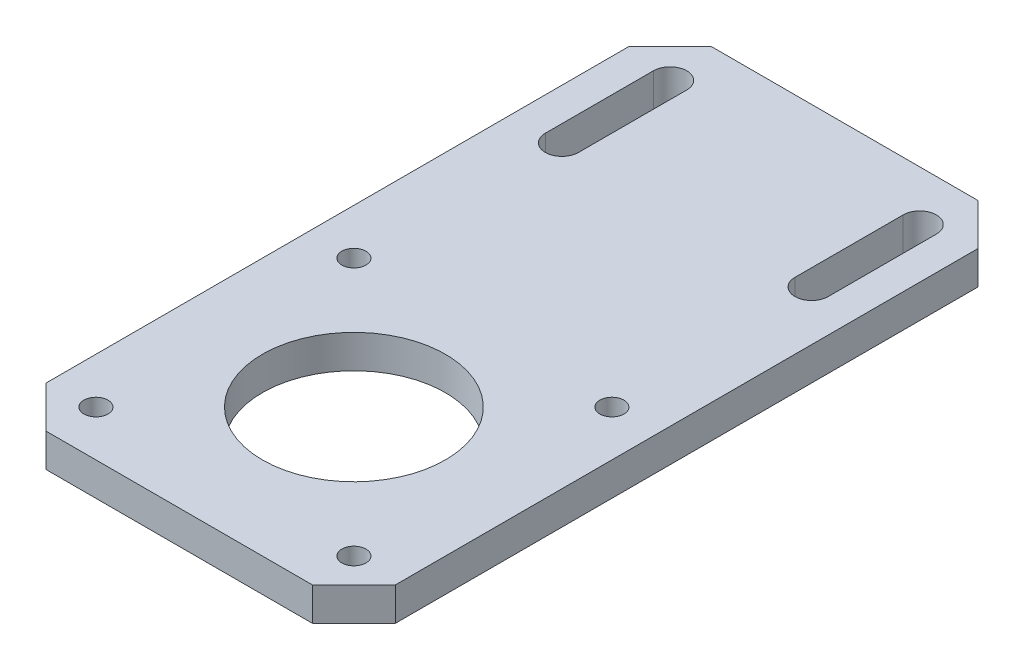
ISO-10303-21;
HEADER;
FILE_DESCRIPTION(('STEP AP214'),'2;1');
FILE_NAME('part.step','',(''),(''),'','','');
FILE_SCHEMA(('AUTOMOTIVE_DESIGN { 1 0 10303 214 1 1 1 1 }'));
ENDSEC;
DATA;
#1=APPLICATION_CONTEXT('core data for automotive mechanical design processes');
#2=APPLICATION_PROTOCOL_DEFINITION('international standard','automotive_design',2000,#1);
#3=PRODUCT_CONTEXT('',#1,'mechanical');
#4=PRODUCT('Part','Part','',(#3));
#5=PRODUCT_RELATED_PRODUCT_CATEGORY('part','',(#4));
#6=PRODUCT_DEFINITION_FORMATION('','',#4);
#7=PRODUCT_DEFINITION_CONTEXT('part definition',#1,'design');
#8=PRODUCT_DEFINITION('design','',#6,#7);
#9=PRODUCT_DEFINITION_SHAPE('','',#8);
#10=(LENGTH_UNIT() NAMED_UNIT(*) SI_UNIT(.MILLI.,.METRE.));
#11=(NAMED_UNIT(*) PLANE_ANGLE_UNIT() SI_UNIT($,.RADIAN.));
#12=(NAMED_UNIT(*) SI_UNIT($,.STERADIAN.) SOLID_ANGLE_UNIT());
#13=UNCERTAINTY_MEASURE_WITH_UNIT(LENGTH_MEASURE(1.E-05),#10,'distance_accuracy_value','');
#14=(GEOMETRIC_REPRESENTATION_CONTEXT(3) GLOBAL_UNCERTAINTY_ASSIGNED_CONTEXT((#13)) GLOBAL_UNIT_ASSIGNED_CONTEXT((#10,
#11,#12)) REPRESENTATION_CONTEXT('',''));
#15=CARTESIAN_POINT('',(0.,0.,0.));
#16=DIRECTION('',(0.,0.,1.));
#17=DIRECTION('',(1.,0.,0.));
#18=AXIS2_PLACEMENT_3D('',#15,#16,#17);
#19=CARTESIAN_POINT('',(0.,4.,0.));
#20=DIRECTION('',(0.,-1.,0.));
#21=DIRECTION('',(0.,0.,-1.));
#22=AXIS2_PLACEMENT_3D('',#19,#20,#21);
#23=PLANE('',#22);
#24=CARTESIAN_POINT('',(6.,4.,-74.));
#25=DIRECTION('',(0.,1.,0.));
#26=DIRECTION('',(0.,0.,1.));
#27=AXIS2_PLACEMENT_3D('',#24,#25,#26);
#28=CIRCLE('',#27,2.);
#29=CARTESIAN_POINT('',(8.,4.,-74.));
#30=VERTEX_POINT('',#29);
#31=CARTESIAN_POINT('',(4.,4.,-74.));
#32=VERTEX_POINT('',#31);
#33=EDGE_CURVE('E194',#30,#32,#28,.T.);
#34=ORIENTED_EDGE('',*,*,#33,.F.);
#35=DIRECTION('',(0.,0.,-1.));
#36=VECTOR('',#35,1.);
#37=CARTESIAN_POINT('',(8.,4.,-74.));
#38=LINE('',#37,#36);
#39=CARTESIAN_POINT('',(8.,4.,-61.));
#40=VERTEX_POINT('',#39);
#41=EDGE_CURVE('E202',#40,#30,#38,.T.);
#42=ORIENTED_EDGE('',*,*,#41,.F.);
#43=CARTESIAN_POINT('',(6.,4.,-61.));
#44=DIRECTION('',(0.,1.,0.));
#45=DIRECTION('',(0.,0.,1.));
#46=AXIS2_PLACEMENT_3D('',#43,#44,#45);
#47=CIRCLE('',#46,2.);
#48=CARTESIAN_POINT('',(4.,4.,-61.));
#49=VERTEX_POINT('',#48);
#50=EDGE_CURVE('E199',#49,#40,#47,.T.);
#51=ORIENTED_EDGE('',*,*,#50,.F.);
#52=DIRECTION('',(0.,0.,1.));
#53=VECTOR('',#52,1.);
#54=CARTESIAN_POINT('',(4.,4.,-74.));
#55=LINE('',#54,#53);
#56=EDGE_CURVE('E196',#32,#49,#55,.T.);
#57=ORIENTED_EDGE('',*,*,#56,.F.);
#58=EDGE_LOOP('',(#34,#42,#51,#57));
#59=FACE_BOUND('',#58,.T.);
#60=DIRECTION('',(0.,0.,-1.));
#61=VECTOR('',#60,1.);
#62=CARTESIAN_POINT('',(42.,4.,0.));
#63=LINE('',#62,#61);
#64=CARTESIAN_POINT('',(42.,4.,-4.99999999999999));
#65=VERTEX_POINT('',#64);
#66=CARTESIAN_POINT('',(42.,4.,-75.));
#67=VERTEX_POINT('',#66);
#68=EDGE_CURVE('E260',#65,#67,#63,.T.);
#69=ORIENTED_EDGE('',*,*,#68,.T.);
#70=DIRECTION('',(0.707106781186546,0.,0.707106781186549));
#71=VECTOR('',#70,1.);
#72=CARTESIAN_POINT('',(37.,4.,-80.));
#73=LINE('',#72,#71);
#74=CARTESIAN_POINT('',(37.,4.,-80.));
#75=VERTEX_POINT('',#74);
#76=EDGE_CURVE('E298',#67,#75,#73,.F.);
#77=ORIENTED_EDGE('',*,*,#76,.T.);
#78=DIRECTION('',(-1.,0.,0.));
#79=VECTOR('',#78,1.);
#80=CARTESIAN_POINT('',(0.,4.,-80.));
#81=LINE('',#80,#79);
#82=CARTESIAN_POINT('',(5.00000000000002,4.,-80.));
#83=VERTEX_POINT('',#82);
#84=EDGE_CURVE('E263',#75,#83,#81,.T.);
#85=ORIENTED_EDGE('',*,*,#84,.T.);
#86=DIRECTION('',(0.707106781186549,0.,-0.707106781186547));
#87=VECTOR('',#86,1.);
#88=CARTESIAN_POINT('',(0.,4.,-75.));
#89=LINE('',#88,#87);
#90=CARTESIAN_POINT('',(0.,4.,-75.));
#91=VERTEX_POINT('',#90);
#92=EDGE_CURVE('E296',#83,#91,#89,.F.);
#93=ORIENTED_EDGE('',*,*,#92,.T.);
#94=DIRECTION('',(0.,0.,1.));
#95=VECTOR('',#94,1.);
#96=CARTESIAN_POINT('',(0.,4.,0.));
#97=LINE('',#96,#95);
#98=CARTESIAN_POINT('',(0.,4.,-5.00000000000002));
#99=VERTEX_POINT('',#98);
#100=EDGE_CURVE('E255',#91,#99,#97,.T.);
#101=ORIENTED_EDGE('',*,*,#100,.T.);
#102=DIRECTION('',(-0.707106781186547,0.,-0.707106781186549));
#103=VECTOR('',#102,1.);
#104=CARTESIAN_POINT('',(5.,4.,0.));
#105=LINE('',#104,#103);
#106=CARTESIAN_POINT('',(5.,4.,0.));
#107=VERTEX_POINT('',#106);
#108=EDGE_CURVE('E59',#99,#107,#105,.F.);
#109=ORIENTED_EDGE('',*,*,#108,.T.);
#110=DIRECTION('',(1.,0.,0.));
#111=VECTOR('',#110,1.);
#112=CARTESIAN_POINT('',(0.,4.,0.));
#113=LINE('',#112,#111);
#114=CARTESIAN_POINT('',(37.,4.,0.));
#115=VERTEX_POINT('',#114);
#116=EDGE_CURVE('E257',#107,#115,#113,.T.);
#117=ORIENTED_EDGE('',*,*,#116,.T.);
#118=DIRECTION('',(-0.707106781186549,0.,0.707106781186547));
#119=VECTOR('',#118,1.);
#120=CARTESIAN_POINT('',(42.,4.,-4.99999999999999));
#121=LINE('',#120,#119);
#122=EDGE_CURVE('E293',#115,#65,#121,.F.);
#123=ORIENTED_EDGE('',*,*,#122,.T.);
#124=EDGE_LOOP('',(#69,#77,#85,#93,#101,#109,#117,#123));
#125=FACE_BOUND('',#124,.T.);
#126=CARTESIAN_POINT('',(21.,4.,-21.));
#127=DIRECTION('',(0.,1.,0.));
#128=DIRECTION('',(0.,0.,1.));
#129=AXIS2_PLACEMENT_3D('',#126,#127,#128);
#130=CIRCLE('',#129,11.);
#131=CARTESIAN_POINT('',(21.,4.,-10.));
#132=VERTEX_POINT('',#131);
#133=EDGE_CURVE('E249',#132,#132,#130,.T.);
#134=ORIENTED_EDGE('',*,*,#133,.F.);
#135=EDGE_LOOP('',(#134));
#136=FACE_BOUND('',#135,.T.);
#137=CARTESIAN_POINT('',(5.5,4.,-36.5));
#138=DIRECTION('',(0.,1.,0.));
#139=DIRECTION('',(0.,0.,1.));
#140=AXIS2_PLACEMENT_3D('',#137,#138,#139);
#141=CIRCLE('',#140,1.45);
#142=CARTESIAN_POINT('',(5.5,4.,-35.05));
#143=VERTEX_POINT('',#142);
#144=EDGE_CURVE('E243',#143,#143,#141,.T.);
#145=ORIENTED_EDGE('',*,*,#144,.F.);
#146=EDGE_LOOP('',(#145));
#147=FACE_BOUND('',#146,.T.);
#148=CARTESIAN_POINT('',(5.5,4.,-5.5));
#149=DIRECTION('',(0.,1.,0.));
#150=DIRECTION('',(0.,0.,1.));
#151=AXIS2_PLACEMENT_3D('',#148,#149,#150);
#152=CIRCLE('',#151,1.45);
#153=CARTESIAN_POINT('',(5.5,4.,-4.05));
#154=VERTEX_POINT('',#153);
#155=EDGE_CURVE('E237',#154,#154,#152,.T.);
#156=ORIENTED_EDGE('',*,*,#155,.F.);
#157=EDGE_LOOP('',(#156));
#158=FACE_BOUND('',#157,.T.);
#159=CARTESIAN_POINT('',(36.5,4.,-36.5));
#160=DIRECTION('',(0.,1.,0.));
#161=DIRECTION('',(0.,0.,1.));
#162=AXIS2_PLACEMENT_3D('',#159,#160,#161);
#163=CIRCLE('',#162,1.45);
#164=CARTESIAN_POINT('',(36.5,4.,-35.05));
#165=VERTEX_POINT('',#164);
#166=EDGE_CURVE('E231',#165,#165,#163,.T.);
#167=ORIENTED_EDGE('',*,*,#166,.F.);
#168=EDGE_LOOP('',(#167));
#169=FACE_BOUND('',#168,.T.);
#170=CARTESIAN_POINT('',(36.5,4.,-5.5));
#171=DIRECTION('',(0.,1.,0.));
#172=DIRECTION('',(0.,0.,1.));
#173=AXIS2_PLACEMENT_3D('',#170,#171,#172);
#174=CIRCLE('',#173,1.45);
#175=CARTESIAN_POINT('',(36.5,4.,-4.05));
#176=VERTEX_POINT('',#175);
#177=EDGE_CURVE('E225',#176,#176,#174,.T.);
#178=ORIENTED_EDGE('',*,*,#177,.F.);
#179=EDGE_LOOP('',(#178));
#180=FACE_BOUND('',#179,.T.);
#181=CARTESIAN_POINT('',(36.,4.,-74.));
#182=DIRECTION('',(0.,1.,0.));
#183=DIRECTION('',(0.,0.,1.));
#184=AXIS2_PLACEMENT_3D('',#181,#182,#183);
#185=CIRCLE('',#184,2.00000000000001);
#186=CARTESIAN_POINT('',(38.,4.,-74.));
#187=VERTEX_POINT('',#186);
#188=CARTESIAN_POINT('',(34.,4.,-74.));
#189=VERTEX_POINT('',#188);
#190=EDGE_CURVE('E153',#187,#189,#185,.T.);
#191=ORIENTED_EDGE('',*,*,#190,.F.);
#192=DIRECTION('',(0.,0.,-1.));
#193=VECTOR('',#192,1.);
#194=CARTESIAN_POINT('',(38.,4.,-74.));
#195=LINE('',#194,#193);
#196=CARTESIAN_POINT('',(38.,4.,-61.));
#197=VERTEX_POINT('',#196);
#198=EDGE_CURVE('E178',#197,#187,#195,.T.);
#199=ORIENTED_EDGE('',*,*,#198,.F.);
#200=CARTESIAN_POINT('',(36.,4.,-61.));
#201=DIRECTION('',(0.,1.,0.));
#202=DIRECTION('',(0.,0.,1.));
#203=AXIS2_PLACEMENT_3D('',#200,#201,#202);
#204=CIRCLE('',#203,2.00000000000001);
#205=CARTESIAN_POINT('',(34.,4.,-61.));
#206=VERTEX_POINT('',#205);
#207=EDGE_CURVE('E176',#206,#197,#204,.T.);
#208=ORIENTED_EDGE('',*,*,#207,.F.);
#209=DIRECTION('',(0.,0.,1.));
#210=VECTOR('',#209,1.);
#211=CARTESIAN_POINT('',(34.,4.,-74.));
#212=LINE('',#211,#210);
#213=EDGE_CURVE('E163',#189,#206,#212,.T.);
#214=ORIENTED_EDGE('',*,*,#213,.F.);
#215=EDGE_LOOP('',(#191,#199,#208,#214));
#216=FACE_BOUND('',#215,.T.);
#217=ADVANCED_FACE('F37',(#59,#125,#136,#147,#158,#169,#180,#216),#23,.F.);
#218=CARTESIAN_POINT('',(0.,0.,0.));
#219=DIRECTION('',(0.,-1.,0.));
#220=DIRECTION('',(0.,0.,-1.));
#221=AXIS2_PLACEMENT_3D('',#218,#219,#220);
#222=PLANE('',#221);
#223=CARTESIAN_POINT('',(36.5,0.,-36.5));
#224=DIRECTION('',(0.,1.,0.));
#225=DIRECTION('',(0.,0.,1.));
#226=AXIS2_PLACEMENT_3D('',#223,#224,#225);
#227=CIRCLE('',#226,1.45);
#228=CARTESIAN_POINT('',(36.5,0.,-35.05));
#229=VERTEX_POINT('',#228);
#230=EDGE_CURVE('E228',#229,#229,#227,.T.);
#231=ORIENTED_EDGE('',*,*,#230,.T.);
#232=EDGE_LOOP('',(#231));
#233=FACE_BOUND('',#232,.T.);
#234=CARTESIAN_POINT('',(5.5,0.,-36.5));
#235=DIRECTION('',(0.,1.,0.));
#236=DIRECTION('',(0.,0.,1.));
#237=AXIS2_PLACEMENT_3D('',#234,#235,#236);
#238=CIRCLE('',#237,1.45);
#239=CARTESIAN_POINT('',(5.5,0.,-35.05));
#240=VERTEX_POINT('',#239);
#241=EDGE_CURVE('E240',#240,#240,#238,.T.);
#242=ORIENTED_EDGE('',*,*,#241,.T.);
#243=EDGE_LOOP('',(#242));
#244=FACE_BOUND('',#243,.T.);
#245=DIRECTION('',(-1.,0.,0.));
#246=VECTOR('',#245,1.);
#247=CARTESIAN_POINT('',(0.,0.,-80.));
#248=LINE('',#247,#246);
#249=CARTESIAN_POINT('',(37.,0.,-80.));
#250=VERTEX_POINT('',#249);
#251=CARTESIAN_POINT('',(5.00000000000002,0.,-80.));
#252=VERTEX_POINT('',#251);
#253=EDGE_CURVE('E258',#250,#252,#248,.T.);
#254=ORIENTED_EDGE('',*,*,#253,.F.);
#255=DIRECTION('',(-0.707106781186546,0.,-0.707106781186549));
#256=VECTOR('',#255,1.);
#257=CARTESIAN_POINT('',(58.5000000000001,0.,-58.4999999999998));
#258=LINE('',#257,#256);
#259=CARTESIAN_POINT('',(42.,0.,-75.));
#260=VERTEX_POINT('',#259);
#261=EDGE_CURVE('E286',#250,#260,#258,.F.);
#262=ORIENTED_EDGE('',*,*,#261,.T.);
#263=DIRECTION('',(0.,0.,-1.));
#264=VECTOR('',#263,1.);
#265=CARTESIAN_POINT('',(42.,0.,0.));
#266=LINE('',#265,#264);
#267=CARTESIAN_POINT('',(42.,0.,-4.99999999999999));
#268=VERTEX_POINT('',#267);
#269=EDGE_CURVE('E271',#268,#260,#266,.T.);
#270=ORIENTED_EDGE('',*,*,#269,.F.);
#271=DIRECTION('',(0.707106781186549,0.,-0.707106781186547));
#272=VECTOR('',#271,1.);
#273=CARTESIAN_POINT('',(18.4999999999999,0.,18.5));
#274=LINE('',#273,#272);
#275=CARTESIAN_POINT('',(37.,0.,0.));
#276=VERTEX_POINT('',#275);
#277=EDGE_CURVE('E280',#268,#276,#274,.F.);
#278=ORIENTED_EDGE('',*,*,#277,.T.);
#279=DIRECTION('',(1.,0.,0.));
#280=VECTOR('',#279,1.);
#281=CARTESIAN_POINT('',(0.,0.,0.));
#282=LINE('',#281,#280);
#283=CARTESIAN_POINT('',(5.,0.,0.));
#284=VERTEX_POINT('',#283);
#285=EDGE_CURVE('E269',#284,#276,#282,.T.);
#286=ORIENTED_EDGE('',*,*,#285,.F.);
#287=DIRECTION('',(0.707106781186547,0.,0.707106781186549));
#288=VECTOR('',#287,1.);
#289=CARTESIAN_POINT('',(2.50000000000001,0.,-2.5));
#290=LINE('',#289,#288);
#291=CARTESIAN_POINT('',(0.,0.,-5.00000000000002));
#292=VERTEX_POINT('',#291);
#293=EDGE_CURVE('E282',#284,#292,#290,.F.);
#294=ORIENTED_EDGE('',*,*,#293,.T.);
#295=DIRECTION('',(0.,0.,1.));
#296=VECTOR('',#295,1.);
#297=CARTESIAN_POINT('',(0.,0.,0.));
#298=LINE('',#297,#296);
#299=CARTESIAN_POINT('',(0.,0.,-75.));
#300=VERTEX_POINT('',#299);
#301=EDGE_CURVE('E252',#300,#292,#298,.T.);
#302=ORIENTED_EDGE('',*,*,#301,.F.);
#303=DIRECTION('',(-0.707106781186549,0.,0.707106781186547));
#304=VECTOR('',#303,1.);
#305=CARTESIAN_POINT('',(-37.5,0.,-37.5000000000001));
#306=LINE('',#305,#304);
#307=EDGE_CURVE('E284',#300,#252,#306,.F.);
#308=ORIENTED_EDGE('',*,*,#307,.T.);
#309=EDGE_LOOP('',(#254,#262,#270,#278,#286,#294,#302,#308));
#310=FACE_BOUND('',#309,.T.);
#311=CARTESIAN_POINT('',(21.,0.,-21.));
#312=DIRECTION('',(0.,1.,0.));
#313=DIRECTION('',(0.,0.,1.));
#314=AXIS2_PLACEMENT_3D('',#311,#312,#313);
#315=CIRCLE('',#314,11.);
#316=CARTESIAN_POINT('',(21.,0.,-10.));
#317=VERTEX_POINT('',#316);
#318=EDGE_CURVE('E246',#317,#317,#315,.T.);
#319=ORIENTED_EDGE('',*,*,#318,.T.);
#320=EDGE_LOOP('',(#319));
#321=FACE_BOUND('',#320,.T.);
#322=CARTESIAN_POINT('',(5.5,0.,-5.5));
#323=DIRECTION('',(0.,1.,0.));
#324=DIRECTION('',(0.,0.,1.));
#325=AXIS2_PLACEMENT_3D('',#322,#323,#324);
#326=CIRCLE('',#325,1.45);
#327=CARTESIAN_POINT('',(5.5,0.,-4.05));
#328=VERTEX_POINT('',#327);
#329=EDGE_CURVE('E234',#328,#328,#326,.T.);
#330=ORIENTED_EDGE('',*,*,#329,.T.);
#331=EDGE_LOOP('',(#330));
#332=FACE_BOUND('',#331,.T.);
#333=CARTESIAN_POINT('',(36.5,0.,-5.5));
#334=DIRECTION('',(0.,1.,0.));
#335=DIRECTION('',(0.,0.,1.));
#336=AXIS2_PLACEMENT_3D('',#333,#334,#335);
#337=CIRCLE('',#336,1.45);
#338=CARTESIAN_POINT('',(36.5,0.,-4.05));
#339=VERTEX_POINT('',#338);
#340=EDGE_CURVE('E224',#339,#339,#337,.T.);
#341=ORIENTED_EDGE('',*,*,#340,.T.);
#342=EDGE_LOOP('',(#341));
#343=FACE_BOUND('',#342,.T.);
#344=DIRECTION('',(0.,0.,-1.));
#345=VECTOR('',#344,1.);
#346=CARTESIAN_POINT('',(8.,0.,-74.));
#347=LINE('',#346,#345);
#348=CARTESIAN_POINT('',(8.,0.,-61.));
#349=VERTEX_POINT('',#348);
#350=CARTESIAN_POINT('',(8.,0.,-74.));
#351=VERTEX_POINT('',#350);
#352=EDGE_CURVE('E197',#349,#351,#347,.T.);
#353=ORIENTED_EDGE('',*,*,#352,.T.);
#354=CARTESIAN_POINT('',(6.,0.,-74.));
#355=DIRECTION('',(0.,1.,0.));
#356=DIRECTION('',(0.,0.,1.));
#357=AXIS2_PLACEMENT_3D('',#354,#355,#356);
#358=CIRCLE('',#357,2.);
#359=CARTESIAN_POINT('',(4.,0.,-74.));
#360=VERTEX_POINT('',#359);
#361=EDGE_CURVE('E171',#351,#360,#358,.T.);
#362=ORIENTED_EDGE('',*,*,#361,.T.);
#363=DIRECTION('',(0.,0.,1.));
#364=VECTOR('',#363,1.);
#365=CARTESIAN_POINT('',(4.,0.,-74.));
#366=LINE('',#365,#364);
#367=CARTESIAN_POINT('',(4.,0.,-61.));
#368=VERTEX_POINT('',#367);
#369=EDGE_CURVE('E207',#360,#368,#366,.T.);
#370=ORIENTED_EDGE('',*,*,#369,.T.);
#371=CARTESIAN_POINT('',(6.,0.,-61.));
#372=DIRECTION('',(0.,1.,0.));
#373=DIRECTION('',(0.,0.,1.));
#374=AXIS2_PLACEMENT_3D('',#371,#372,#373);
#375=CIRCLE('',#374,2.);
#376=EDGE_CURVE('E210',#368,#349,#375,.T.);
#377=ORIENTED_EDGE('',*,*,#376,.T.);
#378=EDGE_LOOP('',(#353,#362,#370,#377));
#379=FACE_BOUND('',#378,.T.);
#380=DIRECTION('',(0.,0.,-1.));
#381=VECTOR('',#380,1.);
#382=CARTESIAN_POINT('',(38.,0.,-74.));
#383=LINE('',#382,#381);
#384=CARTESIAN_POINT('',(38.,0.,-61.));
#385=VERTEX_POINT('',#384);
#386=CARTESIAN_POINT('',(38.,0.,-74.));
#387=VERTEX_POINT('',#386);
#388=EDGE_CURVE('E164',#385,#387,#383,.T.);
#389=ORIENTED_EDGE('',*,*,#388,.T.);
#390=CARTESIAN_POINT('',(36.,0.,-74.));
#391=DIRECTION('',(0.,1.,0.));
#392=DIRECTION('',(0.,0.,1.));
#393=AXIS2_PLACEMENT_3D('',#390,#391,#392);
#394=CIRCLE('',#393,2.00000000000001);
#395=CARTESIAN_POINT('',(34.,0.,-74.));
#396=VERTEX_POINT('',#395);
#397=EDGE_CURVE('E182',#387,#396,#394,.T.);
#398=ORIENTED_EDGE('',*,*,#397,.T.);
#399=DIRECTION('',(0.,0.,1.));
#400=VECTOR('',#399,1.);
#401=CARTESIAN_POINT('',(34.,0.,-74.));
#402=LINE('',#401,#400);
#403=CARTESIAN_POINT('',(34.,0.,-61.));
#404=VERTEX_POINT('',#403);
#405=EDGE_CURVE('E170',#396,#404,#402,.T.);
#406=ORIENTED_EDGE('',*,*,#405,.T.);
#407=CARTESIAN_POINT('',(36.,0.,-61.));
#408=DIRECTION('',(0.,1.,0.));
#409=DIRECTION('',(0.,0.,1.));
#410=AXIS2_PLACEMENT_3D('',#407,#408,#409);
#411=CIRCLE('',#410,2.00000000000001);
#412=EDGE_CURVE('E185',#404,#385,#411,.T.);
#413=ORIENTED_EDGE('',*,*,#412,.T.);
#414=EDGE_LOOP('',(#389,#398,#406,#413));
#415=FACE_BOUND('',#414,.T.);
#416=ADVANCED_FACE('F314',(#233,#244,#310,#321,#332,#343,#379,#415),#222,.T.);
#417=CARTESIAN_POINT('',(0.,4.,0.));
#418=DIRECTION('',(1.,0.,0.));
#419=DIRECTION('',(0.,0.,-1.));
#420=AXIS2_PLACEMENT_3D('',#417,#418,#419);
#421=PLANE('',#420);
#422=ORIENTED_EDGE('',*,*,#100,.F.);
#423=DIRECTION('',(0.,-1.,0.));
#424=VECTOR('',#423,1.);
#425=CARTESIAN_POINT('',(0.,4.,-75.));
#426=LINE('',#425,#424);
#427=EDGE_CURVE('E302',#91,#300,#426,.T.);
#428=ORIENTED_EDGE('',*,*,#427,.T.);
#429=ORIENTED_EDGE('',*,*,#301,.T.);
#430=DIRECTION('',(0.,1.,0.));
#431=VECTOR('',#430,1.);
#432=CARTESIAN_POINT('',(0.,4.,-5.00000000000002));
#433=LINE('',#432,#431);
#434=EDGE_CURVE('E300',#292,#99,#433,.T.);
#435=ORIENTED_EDGE('',*,*,#434,.T.);
#436=EDGE_LOOP('',(#422,#428,#429,#435));
#437=FACE_BOUND('',#436,.T.);
#438=ADVANCED_FACE('F308',(#437),#421,.F.);
#439=CARTESIAN_POINT('',(0.,4.,0.));
#440=DIRECTION('',(0.,0.,-1.));
#441=DIRECTION('',(-1.,0.,0.));
#442=AXIS2_PLACEMENT_3D('',#439,#440,#441);
#443=PLANE('',#442);
#444=ORIENTED_EDGE('',*,*,#116,.F.);
#445=DIRECTION('',(0.,-1.,0.));
#446=VECTOR('',#445,1.);
#447=CARTESIAN_POINT('',(5.,4.,0.));
#448=LINE('',#447,#446);
#449=EDGE_CURVE('E11',#107,#284,#448,.T.);
#450=ORIENTED_EDGE('',*,*,#449,.T.);
#451=ORIENTED_EDGE('',*,*,#285,.T.);
#452=DIRECTION('',(0.,1.,0.));
#453=VECTOR('',#452,1.);
#454=CARTESIAN_POINT('',(37.,4.,0.));
#455=LINE('',#454,#453);
#456=EDGE_CURVE('E46',#276,#115,#455,.T.);
#457=ORIENTED_EDGE('',*,*,#456,.T.);
#458=EDGE_LOOP('',(#444,#450,#451,#457));
#459=FACE_BOUND('',#458,.T.);
#460=ADVANCED_FACE('F320',(#459),#443,.F.);
#461=CARTESIAN_POINT('',(42.,4.,0.));
#462=DIRECTION('',(-1.,0.,0.));
#463=DIRECTION('',(0.,0.,1.));
#464=AXIS2_PLACEMENT_3D('',#461,#462,#463);
#465=PLANE('',#464);
#466=ORIENTED_EDGE('',*,*,#269,.T.);
#467=DIRECTION('',(0.,1.,0.));
#468=VECTOR('',#467,1.);
#469=CARTESIAN_POINT('',(42.,4.,-75.));
#470=LINE('',#469,#468);
#471=EDGE_CURVE('E291',#260,#67,#470,.T.);
#472=ORIENTED_EDGE('',*,*,#471,.T.);
#473=ORIENTED_EDGE('',*,*,#68,.F.);
#474=DIRECTION('',(0.,-1.,0.));
#475=VECTOR('',#474,1.);
#476=CARTESIAN_POINT('',(42.,4.,-4.99999999999999));
#477=LINE('',#476,#475);
#478=EDGE_CURVE('E288',#65,#268,#477,.T.);
#479=ORIENTED_EDGE('',*,*,#478,.T.);
#480=EDGE_LOOP('',(#466,#472,#473,#479));
#481=FACE_BOUND('',#480,.T.);
#482=ADVANCED_FACE('F328',(#481),#465,.F.);
#483=CARTESIAN_POINT('',(0.,4.,-80.));
#484=DIRECTION('',(0.,0.,1.));
#485=DIRECTION('',(1.,0.,0.));
#486=AXIS2_PLACEMENT_3D('',#483,#484,#485);
#487=PLANE('',#486);
#488=ORIENTED_EDGE('',*,*,#84,.F.);
#489=DIRECTION('',(0.,-1.,0.));
#490=VECTOR('',#489,1.);
#491=CARTESIAN_POINT('',(37.,4.,-80.));
#492=LINE('',#491,#490);
#493=EDGE_CURVE('E277',#75,#250,#492,.T.);
#494=ORIENTED_EDGE('',*,*,#493,.T.);
#495=ORIENTED_EDGE('',*,*,#253,.T.);
#496=DIRECTION('',(0.,1.,0.));
#497=VECTOR('',#496,1.);
#498=CARTESIAN_POINT('',(5.00000000000002,4.,-80.));
#499=LINE('',#498,#497);
#500=EDGE_CURVE('E266',#252,#83,#499,.T.);
#501=ORIENTED_EDGE('',*,*,#500,.T.);
#502=EDGE_LOOP('',(#488,#494,#495,#501));
#503=FACE_BOUND('',#502,.T.);
#504=ADVANCED_FACE('F336',(#503),#487,.F.);
#505=CARTESIAN_POINT('',(21.,4.,-21.));
#506=DIRECTION('',(0.,-1.,0.));
#507=DIRECTION('',(0.,0.,-1.));
#508=AXIS2_PLACEMENT_3D('',#505,#506,#507);
#509=CYLINDRICAL_SURFACE('',#508,11.);
#510=ORIENTED_EDGE('',*,*,#133,.T.);
#511=EDGE_LOOP('',(#510));
#512=FACE_BOUND('',#511,.T.);
#513=ORIENTED_EDGE('',*,*,#318,.F.);
#514=EDGE_LOOP('',(#513));
#515=FACE_BOUND('',#514,.T.);
#516=ADVANCED_FACE('F358',(#512,#515),#509,.F.);
#517=CARTESIAN_POINT('',(5.5,4.,-36.5));
#518=DIRECTION('',(0.,-1.,0.));
#519=DIRECTION('',(0.,0.,-1.));
#520=AXIS2_PLACEMENT_3D('',#517,#518,#519);
#521=CYLINDRICAL_SURFACE('',#520,1.45);
#522=ORIENTED_EDGE('',*,*,#144,.T.);
#523=EDGE_LOOP('',(#522));
#524=FACE_BOUND('',#523,.T.);
#525=ORIENTED_EDGE('',*,*,#241,.F.);
#526=EDGE_LOOP('',(#525));
#527=FACE_BOUND('',#526,.T.);
#528=ADVANCED_FACE('F401',(#524,#527),#521,.F.);
#529=CARTESIAN_POINT('',(5.5,4.,-5.5));
#530=DIRECTION('',(0.,-1.,0.));
#531=DIRECTION('',(0.,0.,-1.));
#532=AXIS2_PLACEMENT_3D('',#529,#530,#531);
#533=CYLINDRICAL_SURFACE('',#532,1.45);
#534=ORIENTED_EDGE('',*,*,#155,.T.);
#535=EDGE_LOOP('',(#534));
#536=FACE_BOUND('',#535,.T.);
#537=ORIENTED_EDGE('',*,*,#329,.F.);
#538=EDGE_LOOP('',(#537));
#539=FACE_BOUND('',#538,.T.);
#540=ADVANCED_FACE('F408',(#536,#539),#533,.F.);
#541=CARTESIAN_POINT('',(36.5,4.,-36.5));
#542=DIRECTION('',(0.,-1.,0.));
#543=DIRECTION('',(0.,0.,-1.));
#544=AXIS2_PLACEMENT_3D('',#541,#542,#543);
#545=CYLINDRICAL_SURFACE('',#544,1.45);
#546=ORIENTED_EDGE('',*,*,#166,.T.);
#547=EDGE_LOOP('',(#546));
#548=FACE_BOUND('',#547,.T.);
#549=ORIENTED_EDGE('',*,*,#230,.F.);
#550=EDGE_LOOP('',(#549));
#551=FACE_BOUND('',#550,.T.);
#552=ADVANCED_FACE('F415',(#548,#551),#545,.F.);
#553=CARTESIAN_POINT('',(36.5,4.,-5.5));
#554=DIRECTION('',(0.,-1.,0.));
#555=DIRECTION('',(0.,0.,-1.));
#556=AXIS2_PLACEMENT_3D('',#553,#554,#555);
#557=CYLINDRICAL_SURFACE('',#556,1.45);
#558=ORIENTED_EDGE('',*,*,#177,.T.);
#559=EDGE_LOOP('',(#558));
#560=FACE_BOUND('',#559,.T.);
#561=ORIENTED_EDGE('',*,*,#340,.F.);
#562=EDGE_LOOP('',(#561));
#563=FACE_BOUND('',#562,.T.);
#564=ADVANCED_FACE('F423',(#560,#563),#557,.F.);
#565=CARTESIAN_POINT('',(6.,4.,-74.));
#566=DIRECTION('',(0.,-1.,0.));
#567=DIRECTION('',(0.,0.,-1.));
#568=AXIS2_PLACEMENT_3D('',#565,#566,#567);
#569=CYLINDRICAL_SURFACE('',#568,2.);
#570=ORIENTED_EDGE('',*,*,#361,.F.);
#571=DIRECTION('',(0.,-1.,0.));
#572=VECTOR('',#571,1.);
#573=CARTESIAN_POINT('',(8.,4.,-74.));
#574=LINE('',#573,#572);
#575=EDGE_CURVE('E204',#30,#351,#574,.T.);
#576=ORIENTED_EDGE('',*,*,#575,.F.);
#577=ORIENTED_EDGE('',*,*,#33,.T.);
#578=DIRECTION('',(0.,-1.,0.));
#579=VECTOR('',#578,1.);
#580=CARTESIAN_POINT('',(4.,4.,-74.));
#581=LINE('',#580,#579);
#582=EDGE_CURVE('E221',#32,#360,#581,.T.);
#583=ORIENTED_EDGE('',*,*,#582,.T.);
#584=EDGE_LOOP('',(#570,#576,#577,#583));
#585=FACE_BOUND('',#584,.T.);
#586=ADVANCED_FACE('F431',(#585),#569,.F.);
#587=CARTESIAN_POINT('',(4.,4.,-74.));
#588=DIRECTION('',(1.,0.,0.));
#589=DIRECTION('',(0.,0.,-1.));
#590=AXIS2_PLACEMENT_3D('',#587,#588,#589);
#591=PLANE('',#590);
#592=ORIENTED_EDGE('',*,*,#369,.F.);
#593=ORIENTED_EDGE('',*,*,#582,.F.);
#594=ORIENTED_EDGE('',*,*,#56,.T.);
#595=DIRECTION('',(0.,-1.,0.));
#596=VECTOR('',#595,1.);
#597=CARTESIAN_POINT('',(4.,4.,-61.));
#598=LINE('',#597,#596);
#599=EDGE_CURVE('E219',#49,#368,#598,.T.);
#600=ORIENTED_EDGE('',*,*,#599,.T.);
#601=EDGE_LOOP('',(#592,#593,#594,#600));
#602=FACE_BOUND('',#601,.T.);
#603=ADVANCED_FACE('F439',(#602),#591,.T.);
#604=CARTESIAN_POINT('',(6.,4.,-61.));
#605=DIRECTION('',(0.,-1.,0.));
#606=DIRECTION('',(0.,0.,-1.));
#607=AXIS2_PLACEMENT_3D('',#604,#605,#606);
#608=CYLINDRICAL_SURFACE('',#607,2.);
#609=ORIENTED_EDGE('',*,*,#376,.F.);
#610=ORIENTED_EDGE('',*,*,#599,.F.);
#611=ORIENTED_EDGE('',*,*,#50,.T.);
#612=DIRECTION('',(0.,-1.,0.));
#613=VECTOR('',#612,1.);
#614=CARTESIAN_POINT('',(8.,4.,-61.));
#615=LINE('',#614,#613);
#616=EDGE_CURVE('E217',#40,#349,#615,.T.);
#617=ORIENTED_EDGE('',*,*,#616,.T.);
#618=EDGE_LOOP('',(#609,#610,#611,#617));
#619=FACE_BOUND('',#618,.T.);
#620=ADVANCED_FACE('F447',(#619),#608,.F.);
#621=CARTESIAN_POINT('',(8.,4.,-74.));
#622=DIRECTION('',(-1.,0.,0.));
#623=DIRECTION('',(0.,0.,1.));
#624=AXIS2_PLACEMENT_3D('',#621,#622,#623);
#625=PLANE('',#624);
#626=ORIENTED_EDGE('',*,*,#352,.F.);
#627=ORIENTED_EDGE('',*,*,#616,.F.);
#628=ORIENTED_EDGE('',*,*,#41,.T.);
#629=ORIENTED_EDGE('',*,*,#575,.T.);
#630=EDGE_LOOP('',(#626,#627,#628,#629));
#631=FACE_BOUND('',#630,.T.);
#632=ADVANCED_FACE('F455',(#631),#625,.T.);
#633=CARTESIAN_POINT('',(36.,4.,-74.));
#634=DIRECTION('',(0.,-1.,0.));
#635=DIRECTION('',(0.,0.,-1.));
#636=AXIS2_PLACEMENT_3D('',#633,#634,#635);
#637=CYLINDRICAL_SURFACE('',#636,2.00000000000001);
#638=ORIENTED_EDGE('',*,*,#397,.F.);
#639=DIRECTION('',(0.,-1.,0.));
#640=VECTOR('',#639,1.);
#641=CARTESIAN_POINT('',(38.,4.,-74.));
#642=LINE('',#641,#640);
#643=EDGE_CURVE('E159',#187,#387,#642,.T.);
#644=ORIENTED_EDGE('',*,*,#643,.F.);
#645=ORIENTED_EDGE('',*,*,#190,.T.);
#646=DIRECTION('',(0.,-1.,0.));
#647=VECTOR('',#646,1.);
#648=CARTESIAN_POINT('',(34.,4.,-74.));
#649=LINE('',#648,#647);
#650=EDGE_CURVE('E156',#189,#396,#649,.T.);
#651=ORIENTED_EDGE('',*,*,#650,.T.);
#652=EDGE_LOOP('',(#638,#644,#645,#651));
#653=FACE_BOUND('',#652,.T.);
#654=ADVANCED_FACE('F155',(#653),#637,.F.);
#655=CARTESIAN_POINT('',(34.,4.,-74.));
#656=DIRECTION('',(1.,0.,0.));
#657=DIRECTION('',(0.,0.,-1.));
#658=AXIS2_PLACEMENT_3D('',#655,#656,#657);
#659=PLANE('',#658);
#660=ORIENTED_EDGE('',*,*,#405,.F.);
#661=ORIENTED_EDGE('',*,*,#650,.F.);
#662=ORIENTED_EDGE('',*,*,#213,.T.);
#663=DIRECTION('',(0.,-1.,0.));
#664=VECTOR('',#663,1.);
#665=CARTESIAN_POINT('',(34.,4.,-61.));
#666=LINE('',#665,#664);
#667=EDGE_CURVE('E172',#206,#404,#666,.T.);
#668=ORIENTED_EDGE('',*,*,#667,.T.);
#669=EDGE_LOOP('',(#660,#661,#662,#668));
#670=FACE_BOUND('',#669,.T.);
#671=ADVANCED_FACE('F167',(#670),#659,.T.);
#672=CARTESIAN_POINT('',(36.,4.,-61.));
#673=DIRECTION('',(0.,-1.,0.));
#674=DIRECTION('',(0.,0.,-1.));
#675=AXIS2_PLACEMENT_3D('',#672,#673,#674);
#676=CYLINDRICAL_SURFACE('',#675,2.00000000000001);
#677=ORIENTED_EDGE('',*,*,#412,.F.);
#678=ORIENTED_EDGE('',*,*,#667,.F.);
#679=ORIENTED_EDGE('',*,*,#207,.T.);
#680=DIRECTION('',(0.,-1.,0.));
#681=VECTOR('',#680,1.);
#682=CARTESIAN_POINT('',(38.,4.,-61.));
#683=LINE('',#682,#681);
#684=EDGE_CURVE('E191',#197,#385,#683,.T.);
#685=ORIENTED_EDGE('',*,*,#684,.T.);
#686=EDGE_LOOP('',(#677,#678,#679,#685));
#687=FACE_BOUND('',#686,.T.);
#688=ADVANCED_FACE('F476',(#687),#676,.F.);
#689=CARTESIAN_POINT('',(38.,4.,-74.));
#690=DIRECTION('',(-1.,0.,0.));
#691=DIRECTION('',(0.,0.,1.));
#692=AXIS2_PLACEMENT_3D('',#689,#690,#691);
#693=PLANE('',#692);
#694=ORIENTED_EDGE('',*,*,#388,.F.);
#695=ORIENTED_EDGE('',*,*,#684,.F.);
#696=ORIENTED_EDGE('',*,*,#198,.T.);
#697=ORIENTED_EDGE('',*,*,#643,.T.);
#698=EDGE_LOOP('',(#694,#695,#696,#697));
#699=FACE_BOUND('',#698,.T.);
#700=ADVANCED_FACE('F345',(#699),#693,.T.);
#701=CARTESIAN_POINT('',(37.,4.,-80.));
#702=DIRECTION('',(-0.707106781186549,0.,0.707106781186545));
#703=DIRECTION('',(0.,-1.,0.));
#704=AXIS2_PLACEMENT_3D('',#701,#702,#703);
#705=PLANE('',#704);
#706=ORIENTED_EDGE('',*,*,#76,.F.);
#707=ORIENTED_EDGE('',*,*,#471,.F.);
#708=ORIENTED_EDGE('',*,*,#261,.F.);
#709=ORIENTED_EDGE('',*,*,#493,.F.);
#710=EDGE_LOOP('',(#706,#707,#708,#709));
#711=FACE_BOUND('',#710,.T.);
#712=ADVANCED_FACE('F333',(#711),#705,.F.);
#713=CARTESIAN_POINT('',(0.,4.,-75.));
#714=DIRECTION('',(0.707106781186547,0.,0.707106781186549));
#715=DIRECTION('',(0.,-1.,0.));
#716=AXIS2_PLACEMENT_3D('',#713,#714,#715);
#717=PLANE('',#716);
#718=ORIENTED_EDGE('',*,*,#92,.F.);
#719=ORIENTED_EDGE('',*,*,#500,.F.);
#720=ORIENTED_EDGE('',*,*,#307,.F.);
#721=ORIENTED_EDGE('',*,*,#427,.F.);
#722=EDGE_LOOP('',(#718,#719,#720,#721));
#723=FACE_BOUND('',#722,.T.);
#724=ADVANCED_FACE('F338',(#723),#717,.F.);
#725=CARTESIAN_POINT('',(5.,4.,0.));
#726=DIRECTION('',(0.707106781186549,0.,-0.707106781186547));
#727=DIRECTION('',(0.,-1.,0.));
#728=AXIS2_PLACEMENT_3D('',#725,#726,#727);
#729=PLANE('',#728);
#730=ORIENTED_EDGE('',*,*,#108,.F.);
#731=ORIENTED_EDGE('',*,*,#434,.F.);
#732=ORIENTED_EDGE('',*,*,#293,.F.);
#733=ORIENTED_EDGE('',*,*,#449,.F.);
#734=EDGE_LOOP('',(#730,#731,#732,#733));
#735=FACE_BOUND('',#734,.T.);
#736=ADVANCED_FACE('F319',(#735),#729,.F.);
#737=CARTESIAN_POINT('',(42.,4.,-4.99999999999999));
#738=DIRECTION('',(-0.707106781186546,0.,-0.707106781186548));
#739=DIRECTION('',(0.,-1.,0.));
#740=AXIS2_PLACEMENT_3D('',#737,#738,#739);
#741=PLANE('',#740);
#742=ORIENTED_EDGE('',*,*,#122,.F.);
#743=ORIENTED_EDGE('',*,*,#456,.F.);
#744=ORIENTED_EDGE('',*,*,#277,.F.);
#745=ORIENTED_EDGE('',*,*,#478,.F.);
#746=EDGE_LOOP('',(#742,#743,#744,#745));
#747=FACE_BOUND('',#746,.T.);
#748=ADVANCED_FACE('F40',(#747),#741,.F.);
#749=CLOSED_SHELL('',(#217,#416,#438,#460,#482,#504,#516,#528,#540,#552,#564,#586,#603,#620,
#632,#654,#671,#688,#700,#712,#724,#736,#748));
#750=MANIFOLD_SOLID_BREP('B2',#749);
#751=ADVANCED_BREP_SHAPE_REPRESENTATION('',(#18,#750),#14);
#752=SHAPE_DEFINITION_REPRESENTATION(#9,#751);
ENDSEC;
END-ISO-10303-21;
